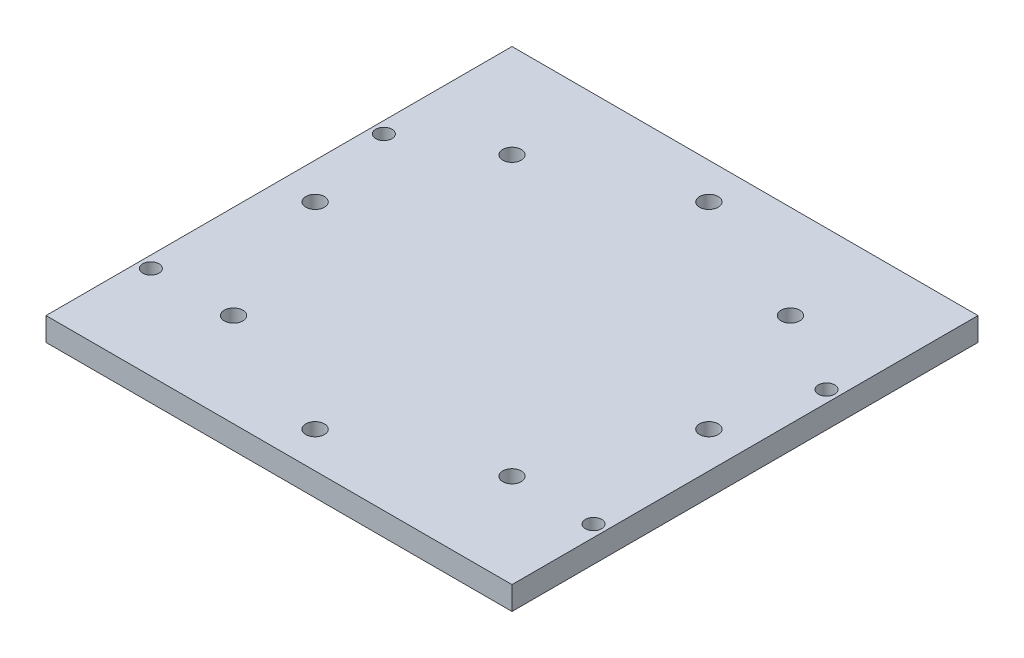
ISO-10303-21;
HEADER;
FILE_DESCRIPTION(('STEP AP214'),'2;1');
FILE_NAME('part.step','',(''),(''),'','','');
FILE_SCHEMA(('AUTOMOTIVE_DESIGN { 1 0 10303 214 1 1 1 1 }'));
ENDSEC;
DATA;
#1=APPLICATION_CONTEXT('core data for automotive mechanical design processes');
#2=APPLICATION_PROTOCOL_DEFINITION('international standard','automotive_design',2000,#1);
#3=PRODUCT_CONTEXT('',#1,'mechanical');
#4=PRODUCT('Part','Part','',(#3));
#5=PRODUCT_RELATED_PRODUCT_CATEGORY('part','',(#4));
#6=PRODUCT_DEFINITION_FORMATION('','',#4);
#7=PRODUCT_DEFINITION_CONTEXT('part definition',#1,'design');
#8=PRODUCT_DEFINITION('design','',#6,#7);
#9=PRODUCT_DEFINITION_SHAPE('','',#8);
#10=(LENGTH_UNIT() NAMED_UNIT(*) SI_UNIT(.MILLI.,.METRE.));
#11=(NAMED_UNIT(*) PLANE_ANGLE_UNIT() SI_UNIT($,.RADIAN.));
#12=(NAMED_UNIT(*) SI_UNIT($,.STERADIAN.) SOLID_ANGLE_UNIT());
#13=UNCERTAINTY_MEASURE_WITH_UNIT(LENGTH_MEASURE(1.E-05),#10,'distance_accuracy_value','');
#14=(GEOMETRIC_REPRESENTATION_CONTEXT(3) GLOBAL_UNCERTAINTY_ASSIGNED_CONTEXT((#13)) GLOBAL_UNIT_ASSIGNED_CONTEXT((#10,
#11,#12)) REPRESENTATION_CONTEXT('',''));
#15=CARTESIAN_POINT('',(0.,0.,0.));
#16=DIRECTION('',(0.,0.,1.));
#17=DIRECTION('',(1.,0.,0.));
#18=AXIS2_PLACEMENT_3D('',#15,#16,#17);
#19=CARTESIAN_POINT('',(0.,5.,0.));
#20=DIRECTION('',(0.,-1.,0.));
#21=DIRECTION('',(0.,0.,-1.));
#22=AXIS2_PLACEMENT_3D('',#19,#20,#21);
#23=PLANE('',#22);
#24=DIRECTION('',(0.,0.,1.));
#25=VECTOR('',#24,1.);
#26=CARTESIAN_POINT('',(0.,5.,0.));
#27=LINE('',#26,#25);
#28=CARTESIAN_POINT('',(0.,5.,-100.));
#29=VERTEX_POINT('',#28);
#30=CARTESIAN_POINT('',(0.,5.,0.));
#31=VERTEX_POINT('',#30);
#32=EDGE_CURVE('E89',#29,#31,#27,.T.);
#33=ORIENTED_EDGE('',*,*,#32,.T.);
#34=DIRECTION('',(1.,0.,0.));
#35=VECTOR('',#34,1.);
#36=CARTESIAN_POINT('',(0.,5.,0.));
#37=LINE('',#36,#35);
#38=CARTESIAN_POINT('',(100.,5.,0.));
#39=VERTEX_POINT('',#38);
#40=EDGE_CURVE('E84',#31,#39,#37,.T.);
#41=ORIENTED_EDGE('',*,*,#40,.T.);
#42=DIRECTION('',(0.,0.,-1.));
#43=VECTOR('',#42,1.);
#44=CARTESIAN_POINT('',(100.,5.,0.));
#45=LINE('',#44,#43);
#46=CARTESIAN_POINT('',(100.,5.,-100.));
#47=VERTEX_POINT('',#46);
#48=EDGE_CURVE('E87',#39,#47,#45,.T.);
#49=ORIENTED_EDGE('',*,*,#48,.T.);
#50=DIRECTION('',(-1.,0.,0.));
#51=VECTOR('',#50,1.);
#52=CARTESIAN_POINT('',(0.,5.,-100.));
#53=LINE('',#52,#51);
#54=EDGE_CURVE('E54',#47,#29,#53,.T.);
#55=ORIENTED_EDGE('',*,*,#54,.T.);
#56=EDGE_LOOP('',(#33,#41,#49,#55));
#57=FACE_BOUND('',#56,.T.);
#58=CARTESIAN_POINT('',(50.,5.,-92.25));
#59=DIRECTION('',(0.,1.,0.));
#60=DIRECTION('',(0.,0.,1.));
#61=AXIS2_PLACEMENT_3D('',#58,#59,#60);
#62=CIRCLE('',#61,2.00000000000001);
#63=CARTESIAN_POINT('',(50.,5.,-90.25));
#64=VERTEX_POINT('',#63);
#65=EDGE_CURVE('E104',#64,#64,#62,.T.);
#66=ORIENTED_EDGE('',*,*,#65,.F.);
#67=EDGE_LOOP('',(#66));
#68=FACE_BOUND('',#67,.T.);
#69=CARTESIAN_POINT('',(2.50000000000001,5.,-19.9999999999977));
#70=DIRECTION('',(0.,1.,0.));
#71=DIRECTION('',(0.,0.,1.));
#72=AXIS2_PLACEMENT_3D('',#69,#70,#71);
#73=CIRCLE('',#72,1.75000000000003);
#74=CARTESIAN_POINT('',(2.50000000000001,5.,-18.2499999999977));
#75=VERTEX_POINT('',#74);
#76=EDGE_CURVE('E119',#75,#75,#73,.T.);
#77=ORIENTED_EDGE('',*,*,#76,.F.);
#78=EDGE_LOOP('',(#77));
#79=FACE_BOUND('',#78,.T.);
#80=CARTESIAN_POINT('',(79.875261505132,5.,-79.8752615051324));
#81=DIRECTION('',(0.,1.,0.));
#82=DIRECTION('',(0.,0.,1.));
#83=AXIS2_PLACEMENT_3D('',#80,#81,#82);
#84=CIRCLE('',#83,2.);
#85=CARTESIAN_POINT('',(79.875261505132,5.,-77.8752615051324));
#86=VERTEX_POINT('',#85);
#87=EDGE_CURVE('E125',#86,#86,#84,.T.);
#88=ORIENTED_EDGE('',*,*,#87,.F.);
#89=EDGE_LOOP('',(#88));
#90=FACE_BOUND('',#89,.T.);
#91=CARTESIAN_POINT('',(92.2500000000008,5.,-50.));
#92=DIRECTION('',(0.,1.,0.));
#93=DIRECTION('',(0.,0.,1.));
#94=AXIS2_PLACEMENT_3D('',#91,#92,#93);
#95=CIRCLE('',#94,1.99999999999912);
#96=CARTESIAN_POINT('',(92.2500000000008,5.,-48.0000000000009));
#97=VERTEX_POINT('',#96);
#98=EDGE_CURVE('E131',#97,#97,#95,.T.);
#99=ORIENTED_EDGE('',*,*,#98,.F.);
#100=EDGE_LOOP('',(#99));
#101=FACE_BOUND('',#100,.T.);
#102=CARTESIAN_POINT('',(79.8752615051326,5.,-20.124738494868));
#103=DIRECTION('',(0.,1.,0.));
#104=DIRECTION('',(0.,0.,1.));
#105=AXIS2_PLACEMENT_3D('',#102,#103,#104);
#106=CIRCLE('',#105,1.99999999999862);
#107=CARTESIAN_POINT('',(79.8752615051326,5.,-18.1247384948694));
#108=VERTEX_POINT('',#107);
#109=EDGE_CURVE('E137',#108,#108,#106,.T.);
#110=ORIENTED_EDGE('',*,*,#109,.F.);
#111=EDGE_LOOP('',(#110));
#112=FACE_BOUND('',#111,.T.);
#113=CARTESIAN_POINT('',(50.0000000000008,5.,-7.74999999999923));
#114=DIRECTION('',(0.,1.,0.));
#115=DIRECTION('',(0.,0.,1.));
#116=AXIS2_PLACEMENT_3D('',#113,#114,#115);
#117=CIRCLE('',#116,1.99999999999852);
#118=CARTESIAN_POINT('',(50.0000000000008,5.,-5.75000000000071));
#119=VERTEX_POINT('',#118);
#120=EDGE_CURVE('E143',#119,#119,#117,.T.);
#121=ORIENTED_EDGE('',*,*,#120,.F.);
#122=EDGE_LOOP('',(#121));
#123=FACE_BOUND('',#122,.T.);
#124=CARTESIAN_POINT('',(20.1247384948684,5.,-20.1247384948684));
#125=DIRECTION('',(0.,1.,0.));
#126=DIRECTION('',(0.,0.,1.));
#127=AXIS2_PLACEMENT_3D('',#124,#125,#126);
#128=CIRCLE('',#127,1.99999999999815);
#129=CARTESIAN_POINT('',(20.1247384948684,5.,-18.1247384948702));
#130=VERTEX_POINT('',#129);
#131=EDGE_CURVE('E149',#130,#130,#128,.T.);
#132=ORIENTED_EDGE('',*,*,#131,.F.);
#133=EDGE_LOOP('',(#132));
#134=FACE_BOUND('',#133,.T.);
#135=CARTESIAN_POINT('',(7.74999999999999,5.,-49.9999999999992));
#136=DIRECTION('',(0.,1.,0.));
#137=DIRECTION('',(0.,0.,1.));
#138=AXIS2_PLACEMENT_3D('',#135,#136,#137);
#139=CIRCLE('',#138,1.99999999999965);
#140=CARTESIAN_POINT('',(7.74999999999999,5.,-47.9999999999996));
#141=VERTEX_POINT('',#140);
#142=EDGE_CURVE('E155',#141,#141,#139,.T.);
#143=ORIENTED_EDGE('',*,*,#142,.F.);
#144=EDGE_LOOP('',(#143));
#145=FACE_BOUND('',#144,.T.);
#146=CARTESIAN_POINT('',(20.1247384948691,5.,-79.8752615051311));
#147=DIRECTION('',(0.,1.,0.));
#148=DIRECTION('',(0.,0.,1.));
#149=AXIS2_PLACEMENT_3D('',#146,#147,#148);
#150=CIRCLE('',#149,2.00000000000002);
#151=CARTESIAN_POINT('',(20.1247384948691,5.,-77.8752615051311));
#152=VERTEX_POINT('',#151);
#153=EDGE_CURVE('E161',#152,#152,#150,.T.);
#154=ORIENTED_EDGE('',*,*,#153,.F.);
#155=EDGE_LOOP('',(#154));
#156=FACE_BOUND('',#155,.T.);
#157=CARTESIAN_POINT('',(2.5,5.,-69.9999999999992));
#158=DIRECTION('',(0.,1.,0.));
#159=DIRECTION('',(0.,0.,-1.));
#160=AXIS2_PLACEMENT_3D('',#157,#158,#159);
#161=CIRCLE('',#160,1.75);
#162=CARTESIAN_POINT('',(2.5,5.,-71.7499999999992));
#163=VERTEX_POINT('',#162);
#164=EDGE_CURVE('E167',#163,#163,#161,.T.);
#165=ORIENTED_EDGE('',*,*,#164,.F.);
#166=EDGE_LOOP('',(#165));
#167=FACE_BOUND('',#166,.T.);
#168=CARTESIAN_POINT('',(97.5000000000014,5.,-19.9999999999977));
#169=DIRECTION('',(0.,1.,0.));
#170=DIRECTION('',(0.,0.,-1.));
#171=AXIS2_PLACEMENT_3D('',#168,#169,#170);
#172=CIRCLE('',#171,1.75);
#173=CARTESIAN_POINT('',(97.5000000000014,5.,-21.7499999999977));
#174=VERTEX_POINT('',#173);
#175=EDGE_CURVE('E173',#174,#174,#172,.T.);
#176=ORIENTED_EDGE('',*,*,#175,.F.);
#177=EDGE_LOOP('',(#176));
#178=FACE_BOUND('',#177,.T.);
#179=CARTESIAN_POINT('',(97.5000000000015,5.,-69.9999999999992));
#180=DIRECTION('',(0.,1.,0.));
#181=DIRECTION('',(0.,0.,1.));
#182=AXIS2_PLACEMENT_3D('',#179,#180,#181);
#183=CIRCLE('',#182,1.75);
#184=CARTESIAN_POINT('',(97.5000000000015,5.,-68.2499999999992));
#185=VERTEX_POINT('',#184);
#186=EDGE_CURVE('E179',#185,#185,#183,.T.);
#187=ORIENTED_EDGE('',*,*,#186,.F.);
#188=EDGE_LOOP('',(#187));
#189=FACE_BOUND('',#188,.T.);
#190=ADVANCED_FACE('F37',(#57,#68,#79,#90,#101,#112,#123,#134,#145,#156,#167,#178,#189),#23,.F.);
#191=CARTESIAN_POINT('',(0.,0.,0.));
#192=DIRECTION('',(0.,-1.,0.));
#193=DIRECTION('',(0.,0.,-1.));
#194=AXIS2_PLACEMENT_3D('',#191,#192,#193);
#195=PLANE('',#194);
#196=CARTESIAN_POINT('',(97.5000000000014,0.,-19.9999999999977));
#197=DIRECTION('',(0.,1.,0.));
#198=DIRECTION('',(0.,0.,-1.));
#199=AXIS2_PLACEMENT_3D('',#196,#197,#198);
#200=CIRCLE('',#199,1.75);
#201=CARTESIAN_POINT('',(97.5000000000014,0.,-21.7499999999977));
#202=VERTEX_POINT('',#201);
#203=EDGE_CURVE('E176',#202,#202,#200,.T.);
#204=ORIENTED_EDGE('',*,*,#203,.T.);
#205=EDGE_LOOP('',(#204));
#206=FACE_BOUND('',#205,.T.);
#207=CARTESIAN_POINT('',(20.1247384948691,0.,-79.8752615051311));
#208=DIRECTION('',(0.,1.,0.));
#209=DIRECTION('',(0.,0.,1.));
#210=AXIS2_PLACEMENT_3D('',#207,#208,#209);
#211=CIRCLE('',#210,2.00000000000002);
#212=CARTESIAN_POINT('',(20.1247384948691,0.,-77.8752615051311));
#213=VERTEX_POINT('',#212);
#214=EDGE_CURVE('E164',#213,#213,#211,.T.);
#215=ORIENTED_EDGE('',*,*,#214,.T.);
#216=EDGE_LOOP('',(#215));
#217=FACE_BOUND('',#216,.T.);
#218=CARTESIAN_POINT('',(20.1247384948684,0.,-20.1247384948684));
#219=DIRECTION('',(0.,1.,0.));
#220=DIRECTION('',(0.,0.,1.));
#221=AXIS2_PLACEMENT_3D('',#218,#219,#220);
#222=CIRCLE('',#221,1.99999999999815);
#223=CARTESIAN_POINT('',(20.1247384948684,0.,-18.1247384948702));
#224=VERTEX_POINT('',#223);
#225=EDGE_CURVE('E152',#224,#224,#222,.T.);
#226=ORIENTED_EDGE('',*,*,#225,.T.);
#227=EDGE_LOOP('',(#226));
#228=FACE_BOUND('',#227,.T.);
#229=CARTESIAN_POINT('',(79.8752615051326,0.,-20.124738494868));
#230=DIRECTION('',(0.,1.,0.));
#231=DIRECTION('',(0.,0.,1.));
#232=AXIS2_PLACEMENT_3D('',#229,#230,#231);
#233=CIRCLE('',#232,1.99999999999862);
#234=CARTESIAN_POINT('',(79.8752615051326,0.,-18.1247384948694));
#235=VERTEX_POINT('',#234);
#236=EDGE_CURVE('E140',#235,#235,#233,.T.);
#237=ORIENTED_EDGE('',*,*,#236,.T.);
#238=EDGE_LOOP('',(#237));
#239=FACE_BOUND('',#238,.T.);
#240=CARTESIAN_POINT('',(79.875261505132,0.,-79.8752615051324));
#241=DIRECTION('',(0.,1.,0.));
#242=DIRECTION('',(0.,0.,1.));
#243=AXIS2_PLACEMENT_3D('',#240,#241,#242);
#244=CIRCLE('',#243,2.);
#245=CARTESIAN_POINT('',(79.875261505132,0.,-77.8752615051324));
#246=VERTEX_POINT('',#245);
#247=EDGE_CURVE('E128',#246,#246,#244,.T.);
#248=ORIENTED_EDGE('',*,*,#247,.T.);
#249=EDGE_LOOP('',(#248));
#250=FACE_BOUND('',#249,.T.);
#251=CARTESIAN_POINT('',(50.,0.,-92.25));
#252=DIRECTION('',(0.,1.,0.));
#253=DIRECTION('',(0.,0.,1.));
#254=AXIS2_PLACEMENT_3D('',#251,#252,#253);
#255=CIRCLE('',#254,2.00000000000001);
#256=CARTESIAN_POINT('',(50.,0.,-90.25));
#257=VERTEX_POINT('',#256);
#258=EDGE_CURVE('E116',#257,#257,#255,.T.);
#259=ORIENTED_EDGE('',*,*,#258,.T.);
#260=EDGE_LOOP('',(#259));
#261=FACE_BOUND('',#260,.T.);
#262=DIRECTION('',(0.,0.,1.));
#263=VECTOR('',#262,1.);
#264=CARTESIAN_POINT('',(0.,0.,0.));
#265=LINE('',#264,#263);
#266=CARTESIAN_POINT('',(0.,0.,-100.));
#267=VERTEX_POINT('',#266);
#268=CARTESIAN_POINT('',(0.,0.,0.));
#269=VERTEX_POINT('',#268);
#270=EDGE_CURVE('E101',#267,#269,#265,.T.);
#271=ORIENTED_EDGE('',*,*,#270,.F.);
#272=DIRECTION('',(-1.,0.,0.));
#273=VECTOR('',#272,1.);
#274=CARTESIAN_POINT('',(0.,0.,-100.));
#275=LINE('',#274,#273);
#276=CARTESIAN_POINT('',(100.,0.,-100.));
#277=VERTEX_POINT('',#276);
#278=EDGE_CURVE('E77',#277,#267,#275,.T.);
#279=ORIENTED_EDGE('',*,*,#278,.F.);
#280=DIRECTION('',(0.,0.,-1.));
#281=VECTOR('',#280,1.);
#282=CARTESIAN_POINT('',(100.,0.,0.));
#283=LINE('',#282,#281);
#284=CARTESIAN_POINT('',(100.,0.,0.));
#285=VERTEX_POINT('',#284);
#286=EDGE_CURVE('E71',#285,#277,#283,.T.);
#287=ORIENTED_EDGE('',*,*,#286,.F.);
#288=DIRECTION('',(1.,0.,0.));
#289=VECTOR('',#288,1.);
#290=CARTESIAN_POINT('',(0.,0.,0.));
#291=LINE('',#290,#289);
#292=EDGE_CURVE('E93',#269,#285,#291,.T.);
#293=ORIENTED_EDGE('',*,*,#292,.F.);
#294=EDGE_LOOP('',(#271,#279,#287,#293));
#295=FACE_BOUND('',#294,.T.);
#296=CARTESIAN_POINT('',(2.50000000000001,0.,-19.9999999999977));
#297=DIRECTION('',(0.,1.,0.));
#298=DIRECTION('',(0.,0.,1.));
#299=AXIS2_PLACEMENT_3D('',#296,#297,#298);
#300=CIRCLE('',#299,1.75000000000003);
#301=CARTESIAN_POINT('',(2.50000000000001,0.,-18.2499999999977));
#302=VERTEX_POINT('',#301);
#303=EDGE_CURVE('E122',#302,#302,#300,.T.);
#304=ORIENTED_EDGE('',*,*,#303,.T.);
#305=EDGE_LOOP('',(#304));
#306=FACE_BOUND('',#305,.T.);
#307=CARTESIAN_POINT('',(92.2500000000008,0.,-50.));
#308=DIRECTION('',(0.,1.,0.));
#309=DIRECTION('',(0.,0.,1.));
#310=AXIS2_PLACEMENT_3D('',#307,#308,#309);
#311=CIRCLE('',#310,1.99999999999912);
#312=CARTESIAN_POINT('',(92.2500000000008,0.,-48.0000000000009));
#313=VERTEX_POINT('',#312);
#314=EDGE_CURVE('E134',#313,#313,#311,.T.);
#315=ORIENTED_EDGE('',*,*,#314,.T.);
#316=EDGE_LOOP('',(#315));
#317=FACE_BOUND('',#316,.T.);
#318=CARTESIAN_POINT('',(50.0000000000008,0.,-7.74999999999923));
#319=DIRECTION('',(0.,1.,0.));
#320=DIRECTION('',(0.,0.,1.));
#321=AXIS2_PLACEMENT_3D('',#318,#319,#320);
#322=CIRCLE('',#321,1.99999999999852);
#323=CARTESIAN_POINT('',(50.0000000000008,0.,-5.75000000000071));
#324=VERTEX_POINT('',#323);
#325=EDGE_CURVE('E146',#324,#324,#322,.T.);
#326=ORIENTED_EDGE('',*,*,#325,.T.);
#327=EDGE_LOOP('',(#326));
#328=FACE_BOUND('',#327,.T.);
#329=CARTESIAN_POINT('',(7.74999999999999,0.,-49.9999999999992));
#330=DIRECTION('',(0.,1.,0.));
#331=DIRECTION('',(0.,0.,1.));
#332=AXIS2_PLACEMENT_3D('',#329,#330,#331);
#333=CIRCLE('',#332,1.99999999999965);
#334=CARTESIAN_POINT('',(7.74999999999999,0.,-47.9999999999996));
#335=VERTEX_POINT('',#334);
#336=EDGE_CURVE('E158',#335,#335,#333,.T.);
#337=ORIENTED_EDGE('',*,*,#336,.T.);
#338=EDGE_LOOP('',(#337));
#339=FACE_BOUND('',#338,.T.);
#340=CARTESIAN_POINT('',(2.5,0.,-69.9999999999992));
#341=DIRECTION('',(0.,1.,0.));
#342=DIRECTION('',(0.,0.,-1.));
#343=AXIS2_PLACEMENT_3D('',#340,#341,#342);
#344=CIRCLE('',#343,1.75);
#345=CARTESIAN_POINT('',(2.5,0.,-71.7499999999992));
#346=VERTEX_POINT('',#345);
#347=EDGE_CURVE('E170',#346,#346,#344,.T.);
#348=ORIENTED_EDGE('',*,*,#347,.T.);
#349=EDGE_LOOP('',(#348));
#350=FACE_BOUND('',#349,.T.);
#351=CARTESIAN_POINT('',(97.5000000000015,0.,-69.9999999999992));
#352=DIRECTION('',(0.,1.,0.));
#353=DIRECTION('',(0.,0.,1.));
#354=AXIS2_PLACEMENT_3D('',#351,#352,#353);
#355=CIRCLE('',#354,1.75);
#356=CARTESIAN_POINT('',(97.5000000000015,0.,-68.2499999999992));
#357=VERTEX_POINT('',#356);
#358=EDGE_CURVE('E182',#357,#357,#355,.T.);
#359=ORIENTED_EDGE('',*,*,#358,.T.);
#360=EDGE_LOOP('',(#359));
#361=FACE_BOUND('',#360,.T.);
#362=ADVANCED_FACE('F112',(#206,#217,#228,#239,#250,#261,#295,#306,#317,#328,#339,#350,#361),
#195,.T.);
#363=CARTESIAN_POINT('',(0.,5.,0.));
#364=DIRECTION('',(1.,0.,0.));
#365=DIRECTION('',(0.,0.,-1.));
#366=AXIS2_PLACEMENT_3D('',#363,#364,#365);
#367=PLANE('',#366);
#368=ORIENTED_EDGE('',*,*,#270,.T.);
#369=DIRECTION('',(0.,-1.,0.));
#370=VECTOR('',#369,1.);
#371=CARTESIAN_POINT('',(0.,5.,0.));
#372=LINE('',#371,#370);
#373=EDGE_CURVE('E11',#31,#269,#372,.T.);
#374=ORIENTED_EDGE('',*,*,#373,.F.);
#375=ORIENTED_EDGE('',*,*,#32,.F.);
#376=DIRECTION('',(0.,-1.,0.));
#377=VECTOR('',#376,1.);
#378=CARTESIAN_POINT('',(0.,5.,-100.));
#379=LINE('',#378,#377);
#380=EDGE_CURVE('E97',#29,#267,#379,.T.);
#381=ORIENTED_EDGE('',*,*,#380,.T.);
#382=EDGE_LOOP('',(#368,#374,#375,#381));
#383=FACE_BOUND('',#382,.T.);
#384=ADVANCED_FACE('F39',(#383),#367,.F.);
#385=CARTESIAN_POINT('',(0.,5.,0.));
#386=DIRECTION('',(0.,0.,-1.));
#387=DIRECTION('',(-1.,0.,0.));
#388=AXIS2_PLACEMENT_3D('',#385,#386,#387);
#389=PLANE('',#388);
#390=ORIENTED_EDGE('',*,*,#292,.T.);
#391=DIRECTION('',(0.,-1.,0.));
#392=VECTOR('',#391,1.);
#393=CARTESIAN_POINT('',(100.,5.,0.));
#394=LINE('',#393,#392);
#395=EDGE_CURVE('E46',#39,#285,#394,.T.);
#396=ORIENTED_EDGE('',*,*,#395,.F.);
#397=ORIENTED_EDGE('',*,*,#40,.F.);
#398=ORIENTED_EDGE('',*,*,#373,.T.);
#399=EDGE_LOOP('',(#390,#396,#397,#398));
#400=FACE_BOUND('',#399,.T.);
#401=ADVANCED_FACE('F92',(#400),#389,.F.);
#402=CARTESIAN_POINT('',(100.,5.,0.));
#403=DIRECTION('',(-1.,0.,0.));
#404=DIRECTION('',(0.,0.,1.));
#405=AXIS2_PLACEMENT_3D('',#402,#403,#404);
#406=PLANE('',#405);
#407=ORIENTED_EDGE('',*,*,#286,.T.);
#408=DIRECTION('',(0.,-1.,0.));
#409=VECTOR('',#408,1.);
#410=CARTESIAN_POINT('',(100.,5.,-100.));
#411=LINE('',#410,#409);
#412=EDGE_CURVE('E94',#47,#277,#411,.T.);
#413=ORIENTED_EDGE('',*,*,#412,.F.);
#414=ORIENTED_EDGE('',*,*,#48,.F.);
#415=ORIENTED_EDGE('',*,*,#395,.T.);
#416=EDGE_LOOP('',(#407,#413,#414,#415));
#417=FACE_BOUND('',#416,.T.);
#418=ADVANCED_FACE('F95',(#417),#406,.F.);
#419=CARTESIAN_POINT('',(0.,5.,-100.));
#420=DIRECTION('',(0.,0.,1.));
#421=DIRECTION('',(1.,0.,0.));
#422=AXIS2_PLACEMENT_3D('',#419,#420,#421);
#423=PLANE('',#422);
#424=ORIENTED_EDGE('',*,*,#278,.T.);
#425=ORIENTED_EDGE('',*,*,#380,.F.);
#426=ORIENTED_EDGE('',*,*,#54,.F.);
#427=ORIENTED_EDGE('',*,*,#412,.T.);
#428=EDGE_LOOP('',(#424,#425,#426,#427));
#429=FACE_BOUND('',#428,.T.);
#430=ADVANCED_FACE('F109',(#429),#423,.F.);
#431=CARTESIAN_POINT('',(50.,5.,-92.25));
#432=DIRECTION('',(0.,-1.,0.));
#433=DIRECTION('',(0.,0.,-1.));
#434=AXIS2_PLACEMENT_3D('',#431,#432,#433);
#435=CYLINDRICAL_SURFACE('',#434,2.00000000000001);
#436=ORIENTED_EDGE('',*,*,#65,.T.);
#437=EDGE_LOOP('',(#436));
#438=FACE_BOUND('',#437,.T.);
#439=ORIENTED_EDGE('',*,*,#258,.F.);
#440=EDGE_LOOP('',(#439));
#441=FACE_BOUND('',#440,.T.);
#442=ADVANCED_FACE('F199',(#438,#441),#435,.F.);
#443=CARTESIAN_POINT('',(2.50000000000001,5.,-19.9999999999977));
#444=DIRECTION('',(0.,-1.,0.));
#445=DIRECTION('',(0.,0.,-1.));
#446=AXIS2_PLACEMENT_3D('',#443,#444,#445);
#447=CYLINDRICAL_SURFACE('',#446,1.75000000000003);
#448=ORIENTED_EDGE('',*,*,#76,.T.);
#449=EDGE_LOOP('',(#448));
#450=FACE_BOUND('',#449,.T.);
#451=ORIENTED_EDGE('',*,*,#303,.F.);
#452=EDGE_LOOP('',(#451));
#453=FACE_BOUND('',#452,.T.);
#454=ADVANCED_FACE('F253',(#450,#453),#447,.F.);
#455=CARTESIAN_POINT('',(79.875261505132,5.,-79.8752615051324));
#456=DIRECTION('',(0.,-1.,0.));
#457=DIRECTION('',(0.,0.,-1.));
#458=AXIS2_PLACEMENT_3D('',#455,#456,#457);
#459=CYLINDRICAL_SURFACE('',#458,2.);
#460=ORIENTED_EDGE('',*,*,#87,.T.);
#461=EDGE_LOOP('',(#460));
#462=FACE_BOUND('',#461,.T.);
#463=ORIENTED_EDGE('',*,*,#247,.F.);
#464=EDGE_LOOP('',(#463));
#465=FACE_BOUND('',#464,.T.);
#466=ADVANCED_FACE('F262',(#462,#465),#459,.F.);
#467=CARTESIAN_POINT('',(92.2500000000008,5.,-50.));
#468=DIRECTION('',(0.,-1.,0.));
#469=DIRECTION('',(0.,0.,-1.));
#470=AXIS2_PLACEMENT_3D('',#467,#468,#469);
#471=CYLINDRICAL_SURFACE('',#470,1.99999999999912);
#472=ORIENTED_EDGE('',*,*,#98,.T.);
#473=EDGE_LOOP('',(#472));
#474=FACE_BOUND('',#473,.T.);
#475=ORIENTED_EDGE('',*,*,#314,.F.);
#476=EDGE_LOOP('',(#475));
#477=FACE_BOUND('',#476,.T.);
#478=ADVANCED_FACE('F271',(#474,#477),#471,.F.);
#479=CARTESIAN_POINT('',(79.8752615051326,5.,-20.124738494868));
#480=DIRECTION('',(0.,-1.,0.));
#481=DIRECTION('',(0.,0.,-1.));
#482=AXIS2_PLACEMENT_3D('',#479,#480,#481);
#483=CYLINDRICAL_SURFACE('',#482,1.99999999999862);
#484=ORIENTED_EDGE('',*,*,#109,.T.);
#485=EDGE_LOOP('',(#484));
#486=FACE_BOUND('',#485,.T.);
#487=ORIENTED_EDGE('',*,*,#236,.F.);
#488=EDGE_LOOP('',(#487));
#489=FACE_BOUND('',#488,.T.);
#490=ADVANCED_FACE('F281',(#486,#489),#483,.F.);
#491=CARTESIAN_POINT('',(50.0000000000008,5.,-7.74999999999923));
#492=DIRECTION('',(0.,-1.,0.));
#493=DIRECTION('',(0.,0.,-1.));
#494=AXIS2_PLACEMENT_3D('',#491,#492,#493);
#495=CYLINDRICAL_SURFACE('',#494,1.99999999999852);
#496=ORIENTED_EDGE('',*,*,#120,.T.);
#497=EDGE_LOOP('',(#496));
#498=FACE_BOUND('',#497,.T.);
#499=ORIENTED_EDGE('',*,*,#325,.F.);
#500=EDGE_LOOP('',(#499));
#501=FACE_BOUND('',#500,.T.);
#502=ADVANCED_FACE('F291',(#498,#501),#495,.F.);
#503=CARTESIAN_POINT('',(20.1247384948684,5.,-20.1247384948684));
#504=DIRECTION('',(0.,-1.,0.));
#505=DIRECTION('',(0.,0.,-1.));
#506=AXIS2_PLACEMENT_3D('',#503,#504,#505);
#507=CYLINDRICAL_SURFACE('',#506,1.99999999999815);
#508=ORIENTED_EDGE('',*,*,#131,.T.);
#509=EDGE_LOOP('',(#508));
#510=FACE_BOUND('',#509,.T.);
#511=ORIENTED_EDGE('',*,*,#225,.F.);
#512=EDGE_LOOP('',(#511));
#513=FACE_BOUND('',#512,.T.);
#514=ADVANCED_FACE('F301',(#510,#513),#507,.F.);
#515=CARTESIAN_POINT('',(7.74999999999999,5.,-49.9999999999992));
#516=DIRECTION('',(0.,-1.,0.));
#517=DIRECTION('',(0.,0.,-1.));
#518=AXIS2_PLACEMENT_3D('',#515,#516,#517);
#519=CYLINDRICAL_SURFACE('',#518,1.99999999999965);
#520=ORIENTED_EDGE('',*,*,#142,.T.);
#521=EDGE_LOOP('',(#520));
#522=FACE_BOUND('',#521,.T.);
#523=ORIENTED_EDGE('',*,*,#336,.F.);
#524=EDGE_LOOP('',(#523));
#525=FACE_BOUND('',#524,.T.);
#526=ADVANCED_FACE('F311',(#522,#525),#519,.F.);
#527=CARTESIAN_POINT('',(20.1247384948691,5.,-79.8752615051311));
#528=DIRECTION('',(0.,-1.,0.));
#529=DIRECTION('',(0.,0.,-1.));
#530=AXIS2_PLACEMENT_3D('',#527,#528,#529);
#531=CYLINDRICAL_SURFACE('',#530,2.00000000000002);
#532=ORIENTED_EDGE('',*,*,#153,.T.);
#533=EDGE_LOOP('',(#532));
#534=FACE_BOUND('',#533,.T.);
#535=ORIENTED_EDGE('',*,*,#214,.F.);
#536=EDGE_LOOP('',(#535));
#537=FACE_BOUND('',#536,.T.);
#538=ADVANCED_FACE('F321',(#534,#537),#531,.F.);
#539=CARTESIAN_POINT('',(2.5,5.,-69.9999999999992));
#540=DIRECTION('',(0.,-1.,0.));
#541=DIRECTION('',(0.,0.,-1.));
#542=AXIS2_PLACEMENT_3D('',#539,#540,#541);
#543=CYLINDRICAL_SURFACE('',#542,1.75);
#544=ORIENTED_EDGE('',*,*,#164,.T.);
#545=EDGE_LOOP('',(#544));
#546=FACE_BOUND('',#545,.T.);
#547=ORIENTED_EDGE('',*,*,#347,.F.);
#548=EDGE_LOOP('',(#547));
#549=FACE_BOUND('',#548,.T.);
#550=ADVANCED_FACE('F331',(#546,#549),#543,.F.);
#551=CARTESIAN_POINT('',(97.5000000000014,5.,-19.9999999999977));
#552=DIRECTION('',(0.,-1.,0.));
#553=DIRECTION('',(0.,0.,-1.));
#554=AXIS2_PLACEMENT_3D('',#551,#552,#553);
#555=CYLINDRICAL_SURFACE('',#554,1.75);
#556=ORIENTED_EDGE('',*,*,#175,.T.);
#557=EDGE_LOOP('',(#556));
#558=FACE_BOUND('',#557,.T.);
#559=ORIENTED_EDGE('',*,*,#203,.F.);
#560=EDGE_LOOP('',(#559));
#561=FACE_BOUND('',#560,.T.);
#562=ADVANCED_FACE('F341',(#558,#561),#555,.F.);
#563=CARTESIAN_POINT('',(97.5000000000015,5.,-69.9999999999992));
#564=DIRECTION('',(0.,-1.,0.));
#565=DIRECTION('',(0.,0.,-1.));
#566=AXIS2_PLACEMENT_3D('',#563,#564,#565);
#567=CYLINDRICAL_SURFACE('',#566,1.75);
#568=ORIENTED_EDGE('',*,*,#186,.T.);
#569=EDGE_LOOP('',(#568));
#570=FACE_BOUND('',#569,.T.);
#571=ORIENTED_EDGE('',*,*,#358,.F.);
#572=EDGE_LOOP('',(#571));
#573=FACE_BOUND('',#572,.T.);
#574=ADVANCED_FACE('F188',(#570,#573),#567,.F.);
#575=CLOSED_SHELL('',(#190,#362,#384,#401,#418,#430,#442,#454,#466,#478,#490,#502,#514,#526,
#538,#550,#562,#574));
#576=MANIFOLD_SOLID_BREP('B2',#575);
#577=ADVANCED_BREP_SHAPE_REPRESENTATION('',(#18,#576),#14);
#578=SHAPE_DEFINITION_REPRESENTATION(#9,#577);
ENDSEC;
END-ISO-10303-21;
